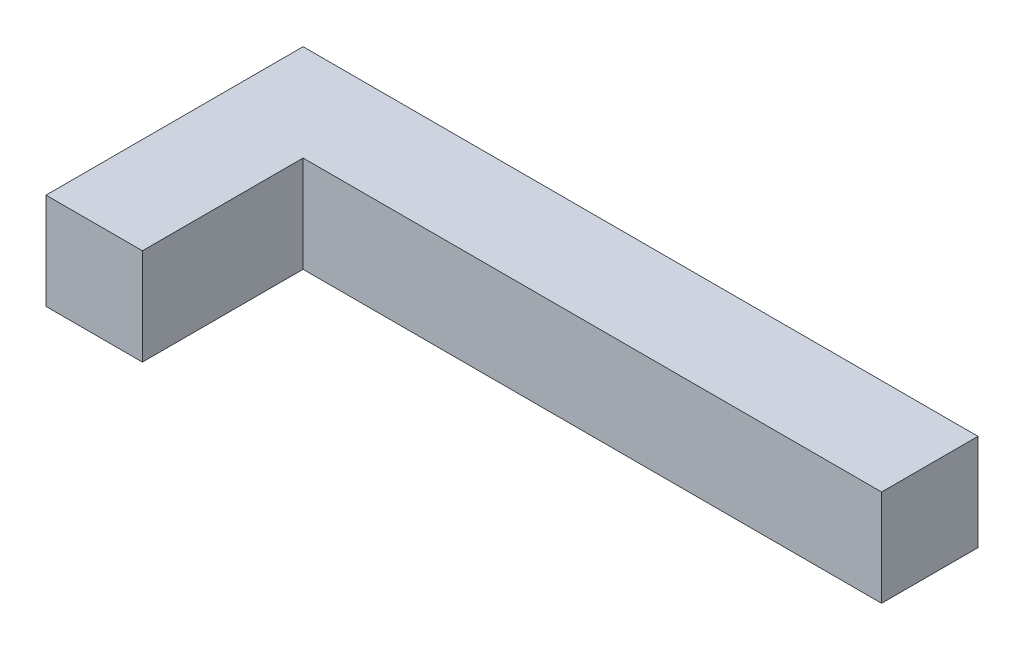
ISO-10303-21;
HEADER;
FILE_DESCRIPTION(('STEP AP214'),'2;1');
FILE_NAME('part.step','',(''),(''),'','','');
FILE_SCHEMA(('AUTOMOTIVE_DESIGN { 1 0 10303 214 1 1 1 1 }'));
ENDSEC;
DATA;
#1=APPLICATION_CONTEXT('core data for automotive mechanical design processes');
#2=APPLICATION_PROTOCOL_DEFINITION('international standard','automotive_design',2000,#1);
#3=PRODUCT_CONTEXT('',#1,'mechanical');
#4=PRODUCT('Part','Part','',(#3));
#5=PRODUCT_RELATED_PRODUCT_CATEGORY('part','',(#4));
#6=PRODUCT_DEFINITION_FORMATION('','',#4);
#7=PRODUCT_DEFINITION_CONTEXT('part definition',#1,'design');
#8=PRODUCT_DEFINITION('design','',#6,#7);
#9=PRODUCT_DEFINITION_SHAPE('','',#8);
#10=(LENGTH_UNIT() NAMED_UNIT(*) SI_UNIT(.MILLI.,.METRE.));
#11=(NAMED_UNIT(*) PLANE_ANGLE_UNIT() SI_UNIT($,.RADIAN.));
#12=(NAMED_UNIT(*) SI_UNIT($,.STERADIAN.) SOLID_ANGLE_UNIT());
#13=UNCERTAINTY_MEASURE_WITH_UNIT(LENGTH_MEASURE(1.E-05),#10,'distance_accuracy_value','');
#14=(GEOMETRIC_REPRESENTATION_CONTEXT(3) GLOBAL_UNCERTAINTY_ASSIGNED_CONTEXT((#13)) GLOBAL_UNIT_ASSIGNED_CONTEXT((#10,
#11,#12)) REPRESENTATION_CONTEXT('',''));
#15=CARTESIAN_POINT('',(0.,0.,0.));
#16=DIRECTION('',(0.,0.,1.));
#17=DIRECTION('',(1.,0.,0.));
#18=AXIS2_PLACEMENT_3D('',#15,#16,#17);
#19=CARTESIAN_POINT('',(15.,0.,40.));
#20=DIRECTION('',(-1.,0.,0.));
#21=DIRECTION('',(0.,-1.,0.));
#22=AXIS2_PLACEMENT_3D('',#19,#20,#21);
#23=PLANE('',#22);
#24=DIRECTION('',(0.,-1.,0.));
#25=VECTOR('',#24,1.);
#26=CARTESIAN_POINT('',(15.,0.,15.));
#27=LINE('',#26,#25);
#28=CARTESIAN_POINT('',(15.,0.,15.));
#29=VERTEX_POINT('',#28);
#30=CARTESIAN_POINT('',(15.,-15.,15.));
#31=VERTEX_POINT('',#30);
#32=EDGE_CURVE('E61',#29,#31,#27,.T.);
#33=ORIENTED_EDGE('',*,*,#32,.F.);
#34=DIRECTION('',(0.,0.,-1.));
#35=VECTOR('',#34,1.);
#36=CARTESIAN_POINT('',(15.,0.,40.));
#37=LINE('',#36,#35);
#38=CARTESIAN_POINT('',(15.,0.,40.));
#39=VERTEX_POINT('',#38);
#40=EDGE_CURVE('E162',#39,#29,#37,.T.);
#41=ORIENTED_EDGE('',*,*,#40,.F.);
#42=DIRECTION('',(0.,1.,0.));
#43=VECTOR('',#42,1.);
#44=CARTESIAN_POINT('',(15.,0.,40.));
#45=LINE('',#44,#43);
#46=CARTESIAN_POINT('',(15.,-15.,40.));
#47=VERTEX_POINT('',#46);
#48=EDGE_CURVE('E150',#47,#39,#45,.T.);
#49=ORIENTED_EDGE('',*,*,#48,.F.);
#50=DIRECTION('',(0.,0.,-1.));
#51=VECTOR('',#50,1.);
#52=CARTESIAN_POINT('',(15.,-15.,40.));
#53=LINE('',#52,#51);
#54=EDGE_CURVE('E54',#47,#31,#53,.T.);
#55=ORIENTED_EDGE('',*,*,#54,.T.);
#56=EDGE_LOOP('',(#33,#41,#49,#55));
#57=FACE_BOUND('',#56,.T.);
#58=ADVANCED_FACE('F45',(#57),#23,.F.);
#59=CARTESIAN_POINT('',(0.,0.,40.));
#60=DIRECTION('',(1.,0.,0.));
#61=DIRECTION('',(0.,1.,0.));
#62=AXIS2_PLACEMENT_3D('',#59,#60,#61);
#63=PLANE('',#62);
#64=DIRECTION('',(0.,-1.,0.));
#65=VECTOR('',#64,1.);
#66=CARTESIAN_POINT('',(0.,0.,0.));
#67=LINE('',#66,#65);
#68=CARTESIAN_POINT('',(0.,0.,0.));
#69=VERTEX_POINT('',#68);
#70=CARTESIAN_POINT('',(0.,-15.,0.));
#71=VERTEX_POINT('',#70);
#72=EDGE_CURVE('E112',#69,#71,#67,.T.);
#73=ORIENTED_EDGE('',*,*,#72,.T.);
#74=DIRECTION('',(0.,0.,-1.));
#75=VECTOR('',#74,1.);
#76=CARTESIAN_POINT('',(0.,-15.,40.));
#77=LINE('',#76,#75);
#78=CARTESIAN_POINT('',(0.,-15.,40.));
#79=VERTEX_POINT('',#78);
#80=EDGE_CURVE('E11',#79,#71,#77,.T.);
#81=ORIENTED_EDGE('',*,*,#80,.F.);
#82=DIRECTION('',(0.,-1.,0.));
#83=VECTOR('',#82,1.);
#84=CARTESIAN_POINT('',(0.,0.,40.));
#85=LINE('',#84,#83);
#86=CARTESIAN_POINT('',(0.,0.,40.));
#87=VERTEX_POINT('',#86);
#88=EDGE_CURVE('E114',#87,#79,#85,.T.);
#89=ORIENTED_EDGE('',*,*,#88,.F.);
#90=DIRECTION('',(0.,0.,-1.));
#91=VECTOR('',#90,1.);
#92=CARTESIAN_POINT('',(0.,0.,40.));
#93=LINE('',#92,#91);
#94=EDGE_CURVE('E155',#87,#69,#93,.T.);
#95=ORIENTED_EDGE('',*,*,#94,.T.);
#96=EDGE_LOOP('',(#73,#81,#89,#95));
#97=FACE_BOUND('',#96,.T.);
#98=ADVANCED_FACE('F47',(#97),#63,.F.);
#99=CARTESIAN_POINT('',(0.,-15.,40.));
#100=DIRECTION('',(0.,1.,0.));
#101=DIRECTION('',(0.,0.,1.));
#102=AXIS2_PLACEMENT_3D('',#99,#100,#101);
#103=PLANE('',#102);
#104=DIRECTION('',(1.,0.,0.));
#105=VECTOR('',#104,1.);
#106=CARTESIAN_POINT('',(0.,-15.,0.));
#107=LINE('',#106,#105);
#108=CARTESIAN_POINT('',(105.,-15.,0.));
#109=VERTEX_POINT('',#108);
#110=EDGE_CURVE('E115',#71,#109,#107,.T.);
#111=ORIENTED_EDGE('',*,*,#110,.T.);
#112=DIRECTION('',(0.,0.,-1.));
#113=VECTOR('',#112,1.);
#114=CARTESIAN_POINT('',(105.,-15.,0.));
#115=LINE('',#114,#113);
#116=CARTESIAN_POINT('',(105.,-15.,15.));
#117=VERTEX_POINT('',#116);
#118=EDGE_CURVE('E130',#117,#109,#115,.T.);
#119=ORIENTED_EDGE('',*,*,#118,.F.);
#120=DIRECTION('',(-1.,0.,0.));
#121=VECTOR('',#120,1.);
#122=CARTESIAN_POINT('',(105.,-15.,15.));
#123=LINE('',#122,#121);
#124=EDGE_CURVE('E139',#117,#31,#123,.T.);
#125=ORIENTED_EDGE('',*,*,#124,.T.);
#126=ORIENTED_EDGE('',*,*,#54,.F.);
#127=DIRECTION('',(1.,0.,0.));
#128=VECTOR('',#127,1.);
#129=CARTESIAN_POINT('',(0.,-15.,40.));
#130=LINE('',#129,#128);
#131=EDGE_CURVE('E92',#79,#47,#130,.T.);
#132=ORIENTED_EDGE('',*,*,#131,.F.);
#133=ORIENTED_EDGE('',*,*,#80,.T.);
#134=EDGE_LOOP('',(#111,#119,#125,#126,#132,#133));
#135=FACE_BOUND('',#134,.T.);
#136=ADVANCED_FACE('F169',(#135),#103,.F.);
#137=CARTESIAN_POINT('',(0.,0.,40.));
#138=DIRECTION('',(0.,-1.,0.));
#139=DIRECTION('',(0.,0.,-1.));
#140=AXIS2_PLACEMENT_3D('',#137,#138,#139);
#141=PLANE('',#140);
#142=DIRECTION('',(-1.,0.,0.));
#143=VECTOR('',#142,1.);
#144=CARTESIAN_POINT('',(0.,0.,0.));
#145=LINE('',#144,#143);
#146=CARTESIAN_POINT('',(105.,0.,0.));
#147=VERTEX_POINT('',#146);
#148=EDGE_CURVE('E85',#147,#69,#145,.T.);
#149=ORIENTED_EDGE('',*,*,#148,.T.);
#150=ORIENTED_EDGE('',*,*,#94,.F.);
#151=DIRECTION('',(-1.,0.,0.));
#152=VECTOR('',#151,1.);
#153=CARTESIAN_POINT('',(0.,0.,40.));
#154=LINE('',#153,#152);
#155=EDGE_CURVE('E70',#39,#87,#154,.T.);
#156=ORIENTED_EDGE('',*,*,#155,.F.);
#157=ORIENTED_EDGE('',*,*,#40,.T.);
#158=DIRECTION('',(-1.,0.,0.));
#159=VECTOR('',#158,1.);
#160=CARTESIAN_POINT('',(105.,0.,15.));
#161=LINE('',#160,#159);
#162=CARTESIAN_POINT('',(105.,0.,15.));
#163=VERTEX_POINT('',#162);
#164=EDGE_CURVE('E121',#163,#29,#161,.T.);
#165=ORIENTED_EDGE('',*,*,#164,.F.);
#166=DIRECTION('',(0.,0.,1.));
#167=VECTOR('',#166,1.);
#168=CARTESIAN_POINT('',(105.,0.,0.));
#169=LINE('',#168,#167);
#170=EDGE_CURVE('E118',#147,#163,#169,.T.);
#171=ORIENTED_EDGE('',*,*,#170,.F.);
#172=EDGE_LOOP('',(#149,#150,#156,#157,#165,#171));
#173=FACE_BOUND('',#172,.T.);
#174=ADVANCED_FACE('F119',(#173),#141,.F.);
#175=CARTESIAN_POINT('',(0.,0.,40.));
#176=DIRECTION('',(0.,0.,1.));
#177=DIRECTION('',(1.,0.,0.));
#178=AXIS2_PLACEMENT_3D('',#175,#176,#177);
#179=PLANE('',#178);
#180=ORIENTED_EDGE('',*,*,#88,.T.);
#181=ORIENTED_EDGE('',*,*,#131,.T.);
#182=ORIENTED_EDGE('',*,*,#48,.T.);
#183=ORIENTED_EDGE('',*,*,#155,.T.);
#184=EDGE_LOOP('',(#180,#181,#182,#183));
#185=FACE_BOUND('',#184,.T.);
#186=ADVANCED_FACE('F173',(#185),#179,.T.);
#187=CARTESIAN_POINT('',(0.,0.,0.));
#188=DIRECTION('',(0.,0.,1.));
#189=DIRECTION('',(1.,0.,0.));
#190=AXIS2_PLACEMENT_3D('',#187,#188,#189);
#191=PLANE('',#190);
#192=ORIENTED_EDGE('',*,*,#72,.F.);
#193=ORIENTED_EDGE('',*,*,#148,.F.);
#194=DIRECTION('',(0.,1.,0.));
#195=VECTOR('',#194,1.);
#196=CARTESIAN_POINT('',(105.,0.,0.));
#197=LINE('',#196,#195);
#198=EDGE_CURVE('E110',#109,#147,#197,.T.);
#199=ORIENTED_EDGE('',*,*,#198,.F.);
#200=ORIENTED_EDGE('',*,*,#110,.F.);
#201=EDGE_LOOP('',(#192,#193,#199,#200));
#202=FACE_BOUND('',#201,.T.);
#203=ADVANCED_FACE('F108',(#202),#191,.F.);
#204=CARTESIAN_POINT('',(105.,0.,15.));
#205=DIRECTION('',(0.,0.,-1.));
#206=DIRECTION('',(0.,1.,0.));
#207=AXIS2_PLACEMENT_3D('',#204,#205,#206);
#208=PLANE('',#207);
#209=ORIENTED_EDGE('',*,*,#32,.T.);
#210=ORIENTED_EDGE('',*,*,#124,.F.);
#211=DIRECTION('',(0.,-1.,0.));
#212=VECTOR('',#211,1.);
#213=CARTESIAN_POINT('',(105.,0.,15.));
#214=LINE('',#213,#212);
#215=EDGE_CURVE('E125',#163,#117,#214,.T.);
#216=ORIENTED_EDGE('',*,*,#215,.F.);
#217=ORIENTED_EDGE('',*,*,#164,.T.);
#218=EDGE_LOOP('',(#209,#210,#216,#217));
#219=FACE_BOUND('',#218,.T.);
#220=ADVANCED_FACE('F168',(#219),#208,.F.);
#221=CARTESIAN_POINT('',(105.,0.,0.));
#222=DIRECTION('',(-1.,0.,0.));
#223=DIRECTION('',(0.,-1.,0.));
#224=AXIS2_PLACEMENT_3D('',#221,#222,#223);
#225=PLANE('',#224);
#226=ORIENTED_EDGE('',*,*,#198,.T.);
#227=ORIENTED_EDGE('',*,*,#170,.T.);
#228=ORIENTED_EDGE('',*,*,#215,.T.);
#229=ORIENTED_EDGE('',*,*,#118,.T.);
#230=EDGE_LOOP('',(#226,#227,#228,#229));
#231=FACE_BOUND('',#230,.T.);
#232=ADVANCED_FACE('F128',(#231),#225,.F.);
#233=CLOSED_SHELL('',(#58,#98,#136,#174,#186,#203,#220,#232));
#234=MANIFOLD_SOLID_BREP('B2',#233);
#235=ADVANCED_BREP_SHAPE_REPRESENTATION('',(#18,#234),#14);
#236=SHAPE_DEFINITION_REPRESENTATION(#9,#235);
ENDSEC;
END-ISO-10303-21;
